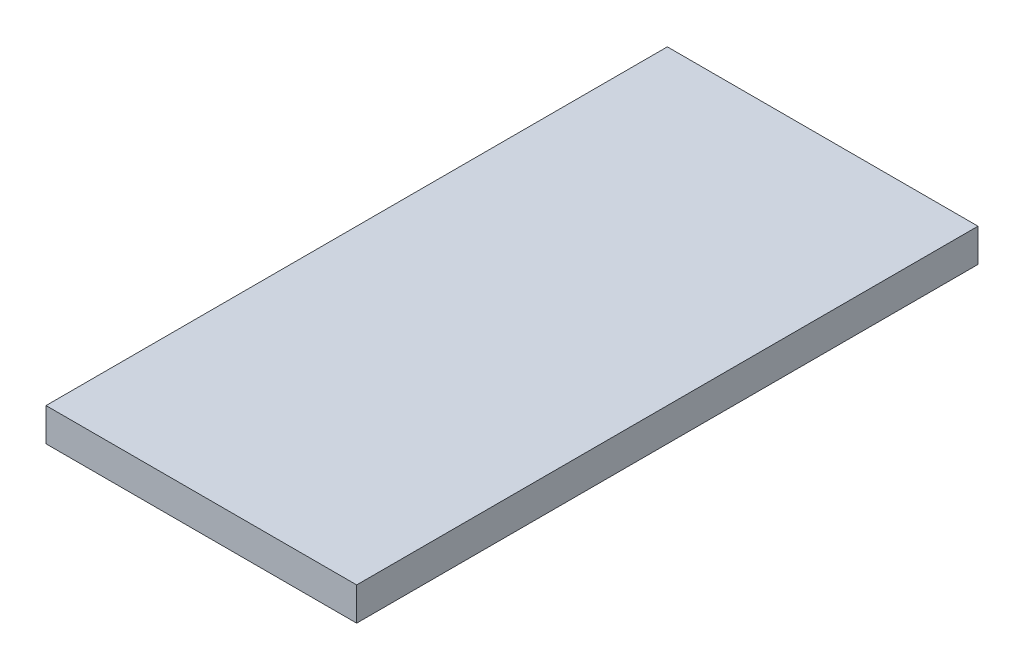
ISO-10303-21;
HEADER;
FILE_DESCRIPTION(('STEP AP214'),'2;1');
FILE_NAME('part.step','',(''),(''),'','','');
FILE_SCHEMA(('AUTOMOTIVE_DESIGN { 1 0 10303 214 1 1 1 1 }'));
ENDSEC;
DATA;
#1=APPLICATION_CONTEXT('core data for automotive mechanical design processes');
#2=APPLICATION_PROTOCOL_DEFINITION('international standard','automotive_design',2000,#1);
#3=PRODUCT_CONTEXT('',#1,'mechanical');
#4=PRODUCT('Part','Part','',(#3));
#5=PRODUCT_RELATED_PRODUCT_CATEGORY('part','',(#4));
#6=PRODUCT_DEFINITION_FORMATION('','',#4);
#7=PRODUCT_DEFINITION_CONTEXT('part definition',#1,'design');
#8=PRODUCT_DEFINITION('design','',#6,#7);
#9=PRODUCT_DEFINITION_SHAPE('','',#8);
#10=(LENGTH_UNIT() NAMED_UNIT(*) SI_UNIT(.MILLI.,.METRE.));
#11=(NAMED_UNIT(*) PLANE_ANGLE_UNIT() SI_UNIT($,.RADIAN.));
#12=(NAMED_UNIT(*) SI_UNIT($,.STERADIAN.) SOLID_ANGLE_UNIT());
#13=UNCERTAINTY_MEASURE_WITH_UNIT(LENGTH_MEASURE(1.E-05),#10,'distance_accuracy_value','');
#14=(GEOMETRIC_REPRESENTATION_CONTEXT(3) GLOBAL_UNCERTAINTY_ASSIGNED_CONTEXT((#13)) GLOBAL_UNIT_ASSIGNED_CONTEXT((#10,
#11,#12)) REPRESENTATION_CONTEXT('',''));
#15=CARTESIAN_POINT('',(0.,0.,0.));
#16=DIRECTION('',(0.,0.,1.));
#17=DIRECTION('',(1.,0.,0.));
#18=AXIS2_PLACEMENT_3D('',#15,#16,#17);
#19=CARTESIAN_POINT('',(0.,1.6,0.));
#20=DIRECTION('',(1.,0.,0.));
#21=DIRECTION('',(0.,0.,-1.));
#22=AXIS2_PLACEMENT_3D('',#19,#20,#21);
#23=PLANE('',#22);
#24=DIRECTION('',(0.,0.,1.));
#25=VECTOR('',#24,1.);
#26=CARTESIAN_POINT('',(0.,0.,0.));
#27=LINE('',#26,#25);
#28=CARTESIAN_POINT('',(0.,0.,-30.));
#29=VERTEX_POINT('',#28);
#30=CARTESIAN_POINT('',(0.,0.,0.));
#31=VERTEX_POINT('',#30);
#32=EDGE_CURVE('E95',#29,#31,#27,.T.);
#33=ORIENTED_EDGE('',*,*,#32,.T.);
#34=DIRECTION('',(0.,-1.,0.));
#35=VECTOR('',#34,1.);
#36=CARTESIAN_POINT('',(0.,1.6,0.));
#37=LINE('',#36,#35);
#38=CARTESIAN_POINT('',(0.,1.6,0.));
#39=VERTEX_POINT('',#38);
#40=EDGE_CURVE('E11',#39,#31,#37,.T.);
#41=ORIENTED_EDGE('',*,*,#40,.F.);
#42=DIRECTION('',(0.,0.,1.));
#43=VECTOR('',#42,1.);
#44=CARTESIAN_POINT('',(0.,1.6,0.));
#45=LINE('',#44,#43);
#46=CARTESIAN_POINT('',(0.,1.6,-30.));
#47=VERTEX_POINT('',#46);
#48=EDGE_CURVE('E83',#47,#39,#45,.T.);
#49=ORIENTED_EDGE('',*,*,#48,.F.);
#50=DIRECTION('',(0.,-1.,0.));
#51=VECTOR('',#50,1.);
#52=CARTESIAN_POINT('',(0.,1.6,-30.));
#53=LINE('',#52,#51);
#54=EDGE_CURVE('E91',#47,#29,#53,.T.);
#55=ORIENTED_EDGE('',*,*,#54,.T.);
#56=EDGE_LOOP('',(#33,#41,#49,#55));
#57=FACE_BOUND('',#56,.T.);
#58=ADVANCED_FACE('F32',(#57),#23,.F.);
#59=CARTESIAN_POINT('',(0.,1.6,0.));
#60=DIRECTION('',(0.,0.,-1.));
#61=DIRECTION('',(-1.,0.,0.));
#62=AXIS2_PLACEMENT_3D('',#59,#60,#61);
#63=PLANE('',#62);
#64=DIRECTION('',(1.,0.,0.));
#65=VECTOR('',#64,1.);
#66=CARTESIAN_POINT('',(0.,0.,0.));
#67=LINE('',#66,#65);
#68=CARTESIAN_POINT('',(15.,0.,0.));
#69=VERTEX_POINT('',#68);
#70=EDGE_CURVE('E87',#31,#69,#67,.T.);
#71=ORIENTED_EDGE('',*,*,#70,.T.);
#72=DIRECTION('',(0.,-1.,0.));
#73=VECTOR('',#72,1.);
#74=CARTESIAN_POINT('',(15.,1.6,0.));
#75=LINE('',#74,#73);
#76=CARTESIAN_POINT('',(15.,1.6,0.));
#77=VERTEX_POINT('',#76);
#78=EDGE_CURVE('E40',#77,#69,#75,.T.);
#79=ORIENTED_EDGE('',*,*,#78,.F.);
#80=DIRECTION('',(1.,0.,0.));
#81=VECTOR('',#80,1.);
#82=CARTESIAN_POINT('',(0.,1.6,0.));
#83=LINE('',#82,#81);
#84=EDGE_CURVE('E78',#39,#77,#83,.T.);
#85=ORIENTED_EDGE('',*,*,#84,.F.);
#86=ORIENTED_EDGE('',*,*,#40,.T.);
#87=EDGE_LOOP('',(#71,#79,#85,#86));
#88=FACE_BOUND('',#87,.T.);
#89=ADVANCED_FACE('F86',(#88),#63,.F.);
#90=CARTESIAN_POINT('',(15.,1.6,0.));
#91=DIRECTION('',(-1.,0.,0.));
#92=DIRECTION('',(0.,0.,1.));
#93=AXIS2_PLACEMENT_3D('',#90,#91,#92);
#94=PLANE('',#93);
#95=DIRECTION('',(0.,0.,-1.));
#96=VECTOR('',#95,1.);
#97=CARTESIAN_POINT('',(15.,0.,0.));
#98=LINE('',#97,#96);
#99=CARTESIAN_POINT('',(15.,0.,-30.));
#100=VERTEX_POINT('',#99);
#101=EDGE_CURVE('E65',#69,#100,#98,.T.);
#102=ORIENTED_EDGE('',*,*,#101,.T.);
#103=DIRECTION('',(0.,-1.,0.));
#104=VECTOR('',#103,1.);
#105=CARTESIAN_POINT('',(15.,1.6,-30.));
#106=LINE('',#105,#104);
#107=CARTESIAN_POINT('',(15.,1.6,-30.));
#108=VERTEX_POINT('',#107);
#109=EDGE_CURVE('E88',#108,#100,#106,.T.);
#110=ORIENTED_EDGE('',*,*,#109,.F.);
#111=DIRECTION('',(0.,0.,-1.));
#112=VECTOR('',#111,1.);
#113=CARTESIAN_POINT('',(15.,1.6,0.));
#114=LINE('',#113,#112);
#115=EDGE_CURVE('E81',#77,#108,#114,.T.);
#116=ORIENTED_EDGE('',*,*,#115,.F.);
#117=ORIENTED_EDGE('',*,*,#78,.T.);
#118=EDGE_LOOP('',(#102,#110,#116,#117));
#119=FACE_BOUND('',#118,.T.);
#120=ADVANCED_FACE('F89',(#119),#94,.F.);
#121=CARTESIAN_POINT('',(0.,1.6,-30.));
#122=DIRECTION('',(0.,0.,1.));
#123=DIRECTION('',(1.,0.,0.));
#124=AXIS2_PLACEMENT_3D('',#121,#122,#123);
#125=PLANE('',#124);
#126=DIRECTION('',(-1.,0.,0.));
#127=VECTOR('',#126,1.);
#128=CARTESIAN_POINT('',(0.,0.,-30.));
#129=LINE('',#128,#127);
#130=EDGE_CURVE('E71',#100,#29,#129,.T.);
#131=ORIENTED_EDGE('',*,*,#130,.T.);
#132=ORIENTED_EDGE('',*,*,#54,.F.);
#133=DIRECTION('',(-1.,0.,0.));
#134=VECTOR('',#133,1.);
#135=CARTESIAN_POINT('',(0.,1.6,-30.));
#136=LINE('',#135,#134);
#137=EDGE_CURVE('E48',#108,#47,#136,.T.);
#138=ORIENTED_EDGE('',*,*,#137,.F.);
#139=ORIENTED_EDGE('',*,*,#109,.T.);
#140=EDGE_LOOP('',(#131,#132,#138,#139));
#141=FACE_BOUND('',#140,.T.);
#142=ADVANCED_FACE('F102',(#141),#125,.F.);
#143=CARTESIAN_POINT('',(0.,1.6,0.));
#144=DIRECTION('',(0.,-1.,0.));
#145=DIRECTION('',(0.,0.,-1.));
#146=AXIS2_PLACEMENT_3D('',#143,#144,#145);
#147=PLANE('',#146);
#148=ORIENTED_EDGE('',*,*,#48,.T.);
#149=ORIENTED_EDGE('',*,*,#84,.T.);
#150=ORIENTED_EDGE('',*,*,#115,.T.);
#151=ORIENTED_EDGE('',*,*,#137,.T.);
#152=EDGE_LOOP('',(#148,#149,#150,#151));
#153=FACE_BOUND('',#152,.T.);
#154=ADVANCED_FACE('F79',(#153),#147,.F.);
#155=CARTESIAN_POINT('',(0.,0.,0.));
#156=DIRECTION('',(0.,-1.,0.));
#157=DIRECTION('',(0.,0.,-1.));
#158=AXIS2_PLACEMENT_3D('',#155,#156,#157);
#159=PLANE('',#158);
#160=ORIENTED_EDGE('',*,*,#32,.F.);
#161=ORIENTED_EDGE('',*,*,#130,.F.);
#162=ORIENTED_EDGE('',*,*,#101,.F.);
#163=ORIENTED_EDGE('',*,*,#70,.F.);
#164=EDGE_LOOP('',(#160,#161,#162,#163));
#165=FACE_BOUND('',#164,.T.);
#166=ADVANCED_FACE('F105',(#165),#159,.T.);
#167=CLOSED_SHELL('',(#58,#89,#120,#142,#154,#166));
#168=MANIFOLD_SOLID_BREP('B2',#167);
#169=ADVANCED_BREP_SHAPE_REPRESENTATION('',(#18,#168),#14);
#170=SHAPE_DEFINITION_REPRESENTATION(#9,#169);
ENDSEC;
END-ISO-10303-21;
